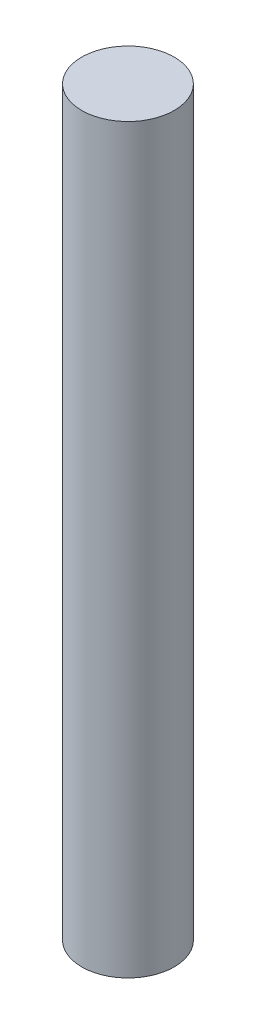
ISO-10303-21;
HEADER;
FILE_DESCRIPTION(('STEP AP214'),'2;1');
FILE_NAME('part.step','',(''),(''),'','','');
FILE_SCHEMA(('AUTOMOTIVE_DESIGN { 1 0 10303 214 1 1 1 1 }'));
ENDSEC;
DATA;
#1=APPLICATION_CONTEXT('core data for automotive mechanical design processes');
#2=APPLICATION_PROTOCOL_DEFINITION('international standard','automotive_design',2000,#1);
#3=PRODUCT_CONTEXT('',#1,'mechanical');
#4=PRODUCT('Part','Part','',(#3));
#5=PRODUCT_RELATED_PRODUCT_CATEGORY('part','',(#4));
#6=PRODUCT_DEFINITION_FORMATION('','',#4);
#7=PRODUCT_DEFINITION_CONTEXT('part definition',#1,'design');
#8=PRODUCT_DEFINITION('design','',#6,#7);
#9=PRODUCT_DEFINITION_SHAPE('','',#8);
#10=(LENGTH_UNIT() NAMED_UNIT(*) SI_UNIT(.MILLI.,.METRE.));
#11=(NAMED_UNIT(*) PLANE_ANGLE_UNIT() SI_UNIT($,.RADIAN.));
#12=(NAMED_UNIT(*) SI_UNIT($,.STERADIAN.) SOLID_ANGLE_UNIT());
#13=UNCERTAINTY_MEASURE_WITH_UNIT(LENGTH_MEASURE(1.E-05),#10,'distance_accuracy_value','');
#14=(GEOMETRIC_REPRESENTATION_CONTEXT(3) GLOBAL_UNCERTAINTY_ASSIGNED_CONTEXT((#13)) GLOBAL_UNIT_ASSIGNED_CONTEXT((#10,
#11,#12)) REPRESENTATION_CONTEXT('',''));
#15=CARTESIAN_POINT('',(0.,0.,0.));
#16=DIRECTION('',(0.,0.,1.));
#17=DIRECTION('',(1.,0.,0.));
#18=AXIS2_PLACEMENT_3D('',#15,#16,#17);
#19=CARTESIAN_POINT('',(0.,80.,0.));
#20=DIRECTION('',(0.,-1.,0.));
#21=DIRECTION('',(0.,0.,-1.));
#22=AXIS2_PLACEMENT_3D('',#19,#20,#21);
#23=CYLINDRICAL_SURFACE('',#22,4.99);
#24=CARTESIAN_POINT('',(0.,80.,0.));
#25=DIRECTION('',(0.,1.,0.));
#26=DIRECTION('',(0.,0.,1.));
#27=AXIS2_PLACEMENT_3D('',#24,#25,#26);
#28=CIRCLE('',#27,4.99);
#29=CARTESIAN_POINT('',(0.,80.,4.99));
#30=VERTEX_POINT('',#29);
#31=EDGE_CURVE('E10',#30,#30,#28,.T.);
#32=ORIENTED_EDGE('',*,*,#31,.F.);
#33=EDGE_LOOP('',(#32));
#34=FACE_BOUND('',#33,.T.);
#35=CARTESIAN_POINT('',(0.,0.,0.));
#36=DIRECTION('',(0.,1.,0.));
#37=DIRECTION('',(0.,0.,1.));
#38=AXIS2_PLACEMENT_3D('',#35,#36,#37);
#39=CIRCLE('',#38,4.99);
#40=CARTESIAN_POINT('',(0.,0.,4.99));
#41=VERTEX_POINT('',#40);
#42=EDGE_CURVE('E46',#41,#41,#39,.T.);
#43=ORIENTED_EDGE('',*,*,#42,.T.);
#44=EDGE_LOOP('',(#43));
#45=FACE_BOUND('',#44,.T.);
#46=ADVANCED_FACE('F43',(#34,#45),#23,.T.);
#47=CARTESIAN_POINT('',(0.,80.,0.));
#48=DIRECTION('',(0.,1.,0.));
#49=DIRECTION('',(0.,0.,1.));
#50=AXIS2_PLACEMENT_3D('',#47,#48,#49);
#51=PLANE('',#50);
#52=ORIENTED_EDGE('',*,*,#31,.T.);
#53=EDGE_LOOP('',(#52));
#54=FACE_BOUND('',#53,.T.);
#55=ADVANCED_FACE('F60',(#54),#51,.T.);
#56=CARTESIAN_POINT('',(0.,0.,0.));
#57=DIRECTION('',(0.,1.,0.));
#58=DIRECTION('',(0.,0.,1.));
#59=AXIS2_PLACEMENT_3D('',#56,#57,#58);
#60=PLANE('',#59);
#61=ORIENTED_EDGE('',*,*,#42,.F.);
#62=EDGE_LOOP('',(#61));
#63=FACE_BOUND('',#62,.T.);
#64=ADVANCED_FACE('F58',(#63),#60,.F.);
#65=CLOSED_SHELL('',(#46,#55,#64));
#66=MANIFOLD_SOLID_BREP('B2',#65);
#67=ADVANCED_BREP_SHAPE_REPRESENTATION('',(#18,#66),#14);
#68=SHAPE_DEFINITION_REPRESENTATION(#9,#67);
ENDSEC;
END-ISO-10303-21;
